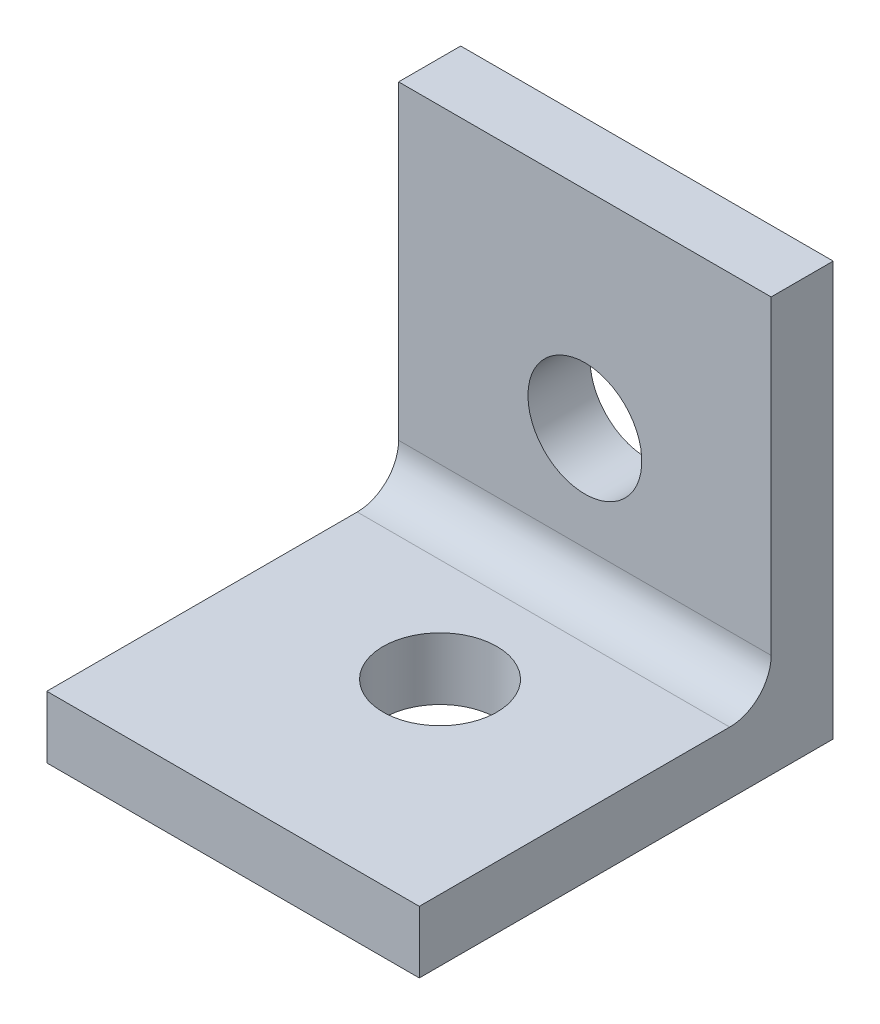
ISO-10303-21;
HEADER;
FILE_DESCRIPTION(('STEP AP214'),'2;1');
FILE_NAME('part.step','',(''),(''),'','','');
FILE_SCHEMA(('AUTOMOTIVE_DESIGN { 1 0 10303 214 1 1 1 1 }'));
ENDSEC;
DATA;
#1=APPLICATION_CONTEXT('core data for automotive mechanical design processes');
#2=APPLICATION_PROTOCOL_DEFINITION('international standard','automotive_design',2000,#1);
#3=PRODUCT_CONTEXT('',#1,'mechanical');
#4=PRODUCT('Part','Part','',(#3));
#5=PRODUCT_RELATED_PRODUCT_CATEGORY('part','',(#4));
#6=PRODUCT_DEFINITION_FORMATION('','',#4);
#7=PRODUCT_DEFINITION_CONTEXT('part definition',#1,'design');
#8=PRODUCT_DEFINITION('design','',#6,#7);
#9=PRODUCT_DEFINITION_SHAPE('','',#8);
#10=(LENGTH_UNIT() NAMED_UNIT(*) SI_UNIT(.MILLI.,.METRE.));
#11=(NAMED_UNIT(*) PLANE_ANGLE_UNIT() SI_UNIT($,.RADIAN.));
#12=(NAMED_UNIT(*) SI_UNIT($,.STERADIAN.) SOLID_ANGLE_UNIT());
#13=UNCERTAINTY_MEASURE_WITH_UNIT(LENGTH_MEASURE(1.E-05),#10,'distance_accuracy_value','');
#14=(GEOMETRIC_REPRESENTATION_CONTEXT(3) GLOBAL_UNCERTAINTY_ASSIGNED_CONTEXT((#13)) GLOBAL_UNIT_ASSIGNED_CONTEXT((#10,
#11,#12)) REPRESENTATION_CONTEXT('',''));
#15=CARTESIAN_POINT('',(0.,0.,0.));
#16=DIRECTION('',(0.,0.,1.));
#17=DIRECTION('',(1.,0.,0.));
#18=AXIS2_PLACEMENT_3D('',#15,#16,#17);
#19=CARTESIAN_POINT('',(0.,3.,-20.));
#20=DIRECTION('',(0.,0.,1.));
#21=DIRECTION('',(1.,0.,0.));
#22=AXIS2_PLACEMENT_3D('',#19,#20,#21);
#23=PLANE('',#22);
#24=DIRECTION('',(-1.,0.,0.));
#25=VECTOR('',#24,1.);
#26=CARTESIAN_POINT('',(0.,0.,-20.));
#27=LINE('',#26,#25);
#28=CARTESIAN_POINT('',(18.,0.,-20.));
#29=VERTEX_POINT('',#28);
#30=CARTESIAN_POINT('',(0.,0.,-20.));
#31=VERTEX_POINT('',#30);
#32=EDGE_CURVE('E133',#29,#31,#27,.T.);
#33=ORIENTED_EDGE('',*,*,#32,.T.);
#34=DIRECTION('',(0.,-1.,0.));
#35=VECTOR('',#34,1.);
#36=CARTESIAN_POINT('',(0.,3.,-20.));
#37=LINE('',#36,#35);
#38=CARTESIAN_POINT('',(0.,20.,-20.));
#39=VERTEX_POINT('',#38);
#40=EDGE_CURVE('E136',#39,#31,#37,.T.);
#41=ORIENTED_EDGE('',*,*,#40,.F.);
#42=DIRECTION('',(-1.,0.,0.));
#43=VECTOR('',#42,1.);
#44=CARTESIAN_POINT('',(0.,20.,-20.));
#45=LINE('',#44,#43);
#46=CARTESIAN_POINT('',(18.,20.,-20.));
#47=VERTEX_POINT('',#46);
#48=EDGE_CURVE('E115',#47,#39,#45,.T.);
#49=ORIENTED_EDGE('',*,*,#48,.F.);
#50=DIRECTION('',(0.,-1.,0.));
#51=VECTOR('',#50,1.);
#52=CARTESIAN_POINT('',(18.,3.,-20.));
#53=LINE('',#52,#51);
#54=EDGE_CURVE('E143',#47,#29,#53,.T.);
#55=ORIENTED_EDGE('',*,*,#54,.T.);
#56=EDGE_LOOP('',(#33,#41,#49,#55));
#57=FACE_BOUND('',#56,.T.);
#58=CARTESIAN_POINT('',(9.,10.,-20.));
#59=DIRECTION('',(0.,0.,-1.));
#60=DIRECTION('',(-1.,0.,0.));
#61=AXIS2_PLACEMENT_3D('',#58,#59,#60);
#62=CIRCLE('',#61,2.75000000000001);
#63=CARTESIAN_POINT('',(6.24999999999999,10.,-20.));
#64=VERTEX_POINT('',#63);
#65=EDGE_CURVE('E166',#64,#64,#62,.T.);
#66=ORIENTED_EDGE('',*,*,#65,.F.);
#67=EDGE_LOOP('',(#66));
#68=FACE_BOUND('',#67,.T.);
#69=ADVANCED_FACE('F39',(#57,#68),#23,.F.);
#70=CARTESIAN_POINT('',(0.,3.,0.));
#71=DIRECTION('',(0.,-1.,0.));
#72=DIRECTION('',(0.,0.,-1.));
#73=AXIS2_PLACEMENT_3D('',#70,#71,#72);
#74=PLANE('',#73);
#75=CARTESIAN_POINT('',(9.,3.,-10.));
#76=DIRECTION('',(0.,-1.,0.));
#77=DIRECTION('',(0.,0.,-1.));
#78=AXIS2_PLACEMENT_3D('',#75,#76,#77);
#79=CIRCLE('',#78,2.75000000000001);
#80=CARTESIAN_POINT('',(9.,3.,-12.75));
#81=VERTEX_POINT('',#80);
#82=EDGE_CURVE('E118',#81,#81,#79,.T.);
#83=ORIENTED_EDGE('',*,*,#82,.T.);
#84=EDGE_LOOP('',(#83));
#85=FACE_BOUND('',#84,.T.);
#86=DIRECTION('',(0.,0.,-1.));
#87=VECTOR('',#86,1.);
#88=CARTESIAN_POINT('',(18.,3.,0.));
#89=LINE('',#88,#87);
#90=CARTESIAN_POINT('',(18.,3.,0.));
#91=VERTEX_POINT('',#90);
#92=CARTESIAN_POINT('',(18.,3.,-15.));
#93=VERTEX_POINT('',#92);
#94=EDGE_CURVE('E135',#91,#93,#89,.T.);
#95=ORIENTED_EDGE('',*,*,#94,.T.);
#96=DIRECTION('',(1.,0.,0.));
#97=VECTOR('',#96,1.);
#98=CARTESIAN_POINT('',(0.,3.,-15.));
#99=LINE('',#98,#97);
#100=CARTESIAN_POINT('',(0.,3.,-15.));
#101=VERTEX_POINT('',#100);
#102=EDGE_CURVE('E60',#93,#101,#99,.F.);
#103=ORIENTED_EDGE('',*,*,#102,.T.);
#104=DIRECTION('',(0.,0.,1.));
#105=VECTOR('',#104,1.);
#106=CARTESIAN_POINT('',(0.,3.,0.));
#107=LINE('',#106,#105);
#108=CARTESIAN_POINT('',(0.,3.,0.));
#109=VERTEX_POINT('',#108);
#110=EDGE_CURVE('E130',#101,#109,#107,.T.);
#111=ORIENTED_EDGE('',*,*,#110,.T.);
#112=DIRECTION('',(1.,0.,0.));
#113=VECTOR('',#112,1.);
#114=CARTESIAN_POINT('',(0.,3.,0.));
#115=LINE('',#114,#113);
#116=EDGE_CURVE('E132',#109,#91,#115,.T.);
#117=ORIENTED_EDGE('',*,*,#116,.T.);
#118=EDGE_LOOP('',(#95,#103,#111,#117));
#119=FACE_BOUND('',#118,.T.);
#120=ADVANCED_FACE('F173',(#85,#119),#74,.F.);
#121=CARTESIAN_POINT('',(0.,3.,0.));
#122=DIRECTION('',(1.,0.,0.));
#123=DIRECTION('',(0.,0.,-1.));
#124=AXIS2_PLACEMENT_3D('',#121,#122,#123);
#125=PLANE('',#124);
#126=DIRECTION('',(0.,0.,1.));
#127=VECTOR('',#126,1.);
#128=CARTESIAN_POINT('',(0.,0.,0.));
#129=LINE('',#128,#127);
#130=CARTESIAN_POINT('',(0.,0.,0.));
#131=VERTEX_POINT('',#130);
#132=EDGE_CURVE('E123',#31,#131,#129,.T.);
#133=ORIENTED_EDGE('',*,*,#132,.T.);
#134=DIRECTION('',(0.,-1.,0.));
#135=VECTOR('',#134,1.);
#136=CARTESIAN_POINT('',(0.,3.,0.));
#137=LINE('',#136,#135);
#138=EDGE_CURVE('E149',#109,#131,#137,.T.);
#139=ORIENTED_EDGE('',*,*,#138,.F.);
#140=ORIENTED_EDGE('',*,*,#110,.F.);
#141=CARTESIAN_POINT('',(0.,5.,-15.));
#142=DIRECTION('',(1.,0.,0.));
#143=DIRECTION('',(0.,0.,-1.));
#144=AXIS2_PLACEMENT_3D('',#141,#142,#143);
#145=CIRCLE('',#144,2.);
#146=CARTESIAN_POINT('',(0.,5.,-17.));
#147=VERTEX_POINT('',#146);
#148=EDGE_CURVE('E11',#101,#147,#145,.T.);
#149=ORIENTED_EDGE('',*,*,#148,.T.);
#150=DIRECTION('',(0.,-1.,0.));
#151=VECTOR('',#150,1.);
#152=CARTESIAN_POINT('',(0.,20.,-17.));
#153=LINE('',#152,#151);
#154=CARTESIAN_POINT('',(0.,20.,-17.));
#155=VERTEX_POINT('',#154);
#156=EDGE_CURVE('E102',#155,#147,#153,.T.);
#157=ORIENTED_EDGE('',*,*,#156,.F.);
#158=DIRECTION('',(0.,0.,1.));
#159=VECTOR('',#158,1.);
#160=CARTESIAN_POINT('',(0.,20.,-20.));
#161=LINE('',#160,#159);
#162=EDGE_CURVE('E109',#39,#155,#161,.T.);
#163=ORIENTED_EDGE('',*,*,#162,.F.);
#164=ORIENTED_EDGE('',*,*,#40,.T.);
#165=EDGE_LOOP('',(#133,#139,#140,#149,#157,#163,#164));
#166=FACE_BOUND('',#165,.T.);
#167=ADVANCED_FACE('F121',(#166),#125,.F.);
#168=CARTESIAN_POINT('',(0.,3.,0.));
#169=DIRECTION('',(0.,0.,-1.));
#170=DIRECTION('',(-1.,0.,0.));
#171=AXIS2_PLACEMENT_3D('',#168,#169,#170);
#172=PLANE('',#171);
#173=DIRECTION('',(1.,0.,0.));
#174=VECTOR('',#173,1.);
#175=CARTESIAN_POINT('',(0.,0.,0.));
#176=LINE('',#175,#174);
#177=CARTESIAN_POINT('',(18.,0.,0.));
#178=VERTEX_POINT('',#177);
#179=EDGE_CURVE('E125',#131,#178,#176,.T.);
#180=ORIENTED_EDGE('',*,*,#179,.T.);
#181=DIRECTION('',(0.,-1.,0.));
#182=VECTOR('',#181,1.);
#183=CARTESIAN_POINT('',(18.,3.,0.));
#184=LINE('',#183,#182);
#185=EDGE_CURVE('E146',#91,#178,#184,.T.);
#186=ORIENTED_EDGE('',*,*,#185,.F.);
#187=ORIENTED_EDGE('',*,*,#116,.F.);
#188=ORIENTED_EDGE('',*,*,#138,.T.);
#189=EDGE_LOOP('',(#180,#186,#187,#188));
#190=FACE_BOUND('',#189,.T.);
#191=ADVANCED_FACE('F188',(#190),#172,.F.);
#192=CARTESIAN_POINT('',(18.,3.,0.));
#193=DIRECTION('',(-1.,0.,0.));
#194=DIRECTION('',(0.,0.,1.));
#195=AXIS2_PLACEMENT_3D('',#192,#193,#194);
#196=PLANE('',#195);
#197=DIRECTION('',(0.,0.,-1.));
#198=VECTOR('',#197,1.);
#199=CARTESIAN_POINT('',(18.,0.,0.));
#200=LINE('',#199,#198);
#201=EDGE_CURVE('E139',#178,#29,#200,.T.);
#202=ORIENTED_EDGE('',*,*,#201,.T.);
#203=ORIENTED_EDGE('',*,*,#54,.F.);
#204=DIRECTION('',(0.,0.,-1.));
#205=VECTOR('',#204,1.);
#206=CARTESIAN_POINT('',(18.,20.,-20.));
#207=LINE('',#206,#205);
#208=CARTESIAN_POINT('',(18.,20.,-17.));
#209=VERTEX_POINT('',#208);
#210=EDGE_CURVE('E108',#209,#47,#207,.T.);
#211=ORIENTED_EDGE('',*,*,#210,.F.);
#212=DIRECTION('',(0.,-1.,0.));
#213=VECTOR('',#212,1.);
#214=CARTESIAN_POINT('',(18.,20.,-17.));
#215=LINE('',#214,#213);
#216=CARTESIAN_POINT('',(18.,5.,-17.));
#217=VERTEX_POINT('',#216);
#218=EDGE_CURVE('E104',#209,#217,#215,.T.);
#219=ORIENTED_EDGE('',*,*,#218,.T.);
#220=CARTESIAN_POINT('',(18.,5.,-15.));
#221=DIRECTION('',(-1.,0.,0.));
#222=DIRECTION('',(0.,0.,1.));
#223=AXIS2_PLACEMENT_3D('',#220,#221,#222);
#224=CIRCLE('',#223,2.);
#225=EDGE_CURVE('E47',#217,#93,#224,.T.);
#226=ORIENTED_EDGE('',*,*,#225,.T.);
#227=ORIENTED_EDGE('',*,*,#94,.F.);
#228=ORIENTED_EDGE('',*,*,#185,.T.);
#229=EDGE_LOOP('',(#202,#203,#211,#219,#226,#227,#228));
#230=FACE_BOUND('',#229,.T.);
#231=ADVANCED_FACE('F155',(#230),#196,.F.);
#232=CARTESIAN_POINT('',(0.,0.,0.));
#233=DIRECTION('',(0.,-1.,0.));
#234=DIRECTION('',(0.,0.,-1.));
#235=AXIS2_PLACEMENT_3D('',#232,#233,#234);
#236=PLANE('',#235);
#237=CARTESIAN_POINT('',(9.,0.,-10.));
#238=DIRECTION('',(0.,-1.,0.));
#239=DIRECTION('',(0.,0.,-1.));
#240=AXIS2_PLACEMENT_3D('',#237,#238,#239);
#241=CIRCLE('',#240,2.75000000000001);
#242=CARTESIAN_POINT('',(9.,0.,-12.75));
#243=VERTEX_POINT('',#242);
#244=EDGE_CURVE('E160',#243,#243,#241,.T.);
#245=ORIENTED_EDGE('',*,*,#244,.F.);
#246=EDGE_LOOP('',(#245));
#247=FACE_BOUND('',#246,.T.);
#248=ORIENTED_EDGE('',*,*,#132,.F.);
#249=ORIENTED_EDGE('',*,*,#32,.F.);
#250=ORIENTED_EDGE('',*,*,#201,.F.);
#251=ORIENTED_EDGE('',*,*,#179,.F.);
#252=EDGE_LOOP('',(#248,#249,#250,#251));
#253=FACE_BOUND('',#252,.T.);
#254=ADVANCED_FACE('F185',(#247,#253),#236,.T.);
#255=CARTESIAN_POINT('',(0.,20.,-17.));
#256=DIRECTION('',(0.,0.,-1.));
#257=DIRECTION('',(-1.,0.,0.));
#258=AXIS2_PLACEMENT_3D('',#255,#256,#257);
#259=PLANE('',#258);
#260=CARTESIAN_POINT('',(9.,10.,-17.));
#261=DIRECTION('',(0.,0.,-1.));
#262=DIRECTION('',(-1.,0.,0.));
#263=AXIS2_PLACEMENT_3D('',#260,#261,#262);
#264=CIRCLE('',#263,2.75000000000001);
#265=CARTESIAN_POINT('',(6.24999999999999,10.,-17.));
#266=VERTEX_POINT('',#265);
#267=EDGE_CURVE('E163',#266,#266,#264,.T.);
#268=ORIENTED_EDGE('',*,*,#267,.T.);
#269=EDGE_LOOP('',(#268));
#270=FACE_BOUND('',#269,.T.);
#271=ORIENTED_EDGE('',*,*,#156,.T.);
#272=DIRECTION('',(1.,0.,0.));
#273=VECTOR('',#272,1.);
#274=CARTESIAN_POINT('',(18.,5.,-17.));
#275=LINE('',#274,#273);
#276=EDGE_CURVE('E152',#147,#217,#275,.T.);
#277=ORIENTED_EDGE('',*,*,#276,.T.);
#278=ORIENTED_EDGE('',*,*,#218,.F.);
#279=DIRECTION('',(1.,0.,0.));
#280=VECTOR('',#279,1.);
#281=CARTESIAN_POINT('',(0.,20.,-17.));
#282=LINE('',#281,#280);
#283=EDGE_CURVE('E97',#155,#209,#282,.T.);
#284=ORIENTED_EDGE('',*,*,#283,.F.);
#285=EDGE_LOOP('',(#271,#277,#278,#284));
#286=FACE_BOUND('',#285,.T.);
#287=ADVANCED_FACE('F99',(#270,#286),#259,.F.);
#288=CARTESIAN_POINT('',(0.,20.,0.));
#289=DIRECTION('',(0.,1.,0.));
#290=DIRECTION('',(0.,0.,1.));
#291=AXIS2_PLACEMENT_3D('',#288,#289,#290);
#292=PLANE('',#291);
#293=ORIENTED_EDGE('',*,*,#162,.T.);
#294=ORIENTED_EDGE('',*,*,#283,.T.);
#295=ORIENTED_EDGE('',*,*,#210,.T.);
#296=ORIENTED_EDGE('',*,*,#48,.T.);
#297=EDGE_LOOP('',(#293,#294,#295,#296));
#298=FACE_BOUND('',#297,.T.);
#299=ADVANCED_FACE('F113',(#298),#292,.T.);
#300=CARTESIAN_POINT('',(9.,0.,-10.));
#301=DIRECTION('',(0.,-1.,0.));
#302=DIRECTION('',(0.,0.,-1.));
#303=AXIS2_PLACEMENT_3D('',#300,#301,#302);
#304=CYLINDRICAL_SURFACE('',#303,2.75000000000001);
#305=ORIENTED_EDGE('',*,*,#82,.F.);
#306=EDGE_LOOP('',(#305));
#307=FACE_BOUND('',#306,.T.);
#308=ORIENTED_EDGE('',*,*,#244,.T.);
#309=EDGE_LOOP('',(#308));
#310=FACE_BOUND('',#309,.T.);
#311=ADVANCED_FACE('F226',(#307,#310),#304,.F.);
#312=CARTESIAN_POINT('',(9.,10.,-20.));
#313=DIRECTION('',(0.,0.,-1.));
#314=DIRECTION('',(-1.,0.,0.));
#315=AXIS2_PLACEMENT_3D('',#312,#313,#314);
#316=CYLINDRICAL_SURFACE('',#315,2.75000000000001);
#317=ORIENTED_EDGE('',*,*,#267,.F.);
#318=EDGE_LOOP('',(#317));
#319=FACE_BOUND('',#318,.T.);
#320=ORIENTED_EDGE('',*,*,#65,.T.);
#321=EDGE_LOOP('',(#320));
#322=FACE_BOUND('',#321,.T.);
#323=ADVANCED_FACE('F170',(#319,#322),#316,.F.);
#324=CARTESIAN_POINT('',(0.,5.,-15.));
#325=DIRECTION('',(-1.,0.,0.));
#326=DIRECTION('',(0.,0.,1.));
#327=AXIS2_PLACEMENT_3D('',#324,#325,#326);
#328=CYLINDRICAL_SURFACE('',#327,2.);
#329=ORIENTED_EDGE('',*,*,#148,.F.);
#330=ORIENTED_EDGE('',*,*,#102,.F.);
#331=ORIENTED_EDGE('',*,*,#225,.F.);
#332=ORIENTED_EDGE('',*,*,#276,.F.);
#333=EDGE_LOOP('',(#329,#330,#331,#332));
#334=FACE_BOUND('',#333,.T.);
#335=ADVANCED_FACE('F41',(#334),#328,.F.);
#336=CLOSED_SHELL('',(#69,#120,#167,#191,#231,#254,#287,#299,#311,#323,#335));
#337=MANIFOLD_SOLID_BREP('B2',#336);
#338=ADVANCED_BREP_SHAPE_REPRESENTATION('',(#18,#337),#14);
#339=SHAPE_DEFINITION_REPRESENTATION(#9,#338);
ENDSEC;
END-ISO-10303-21;
